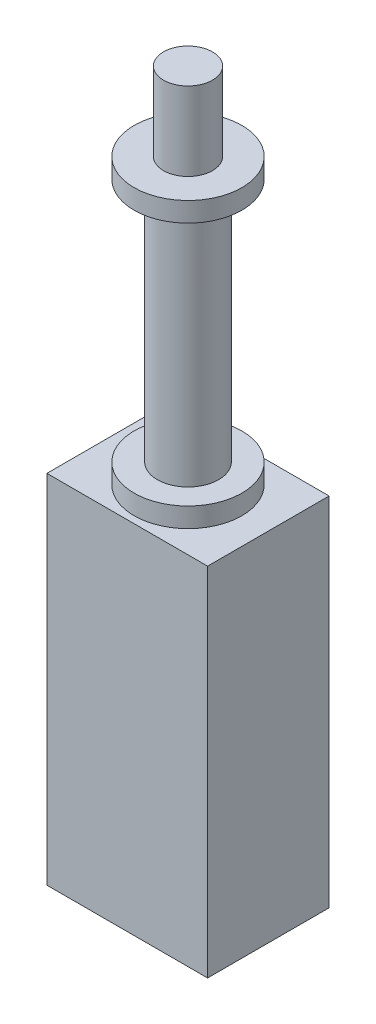
ISO-10303-21;
HEADER;
FILE_DESCRIPTION(('STEP AP214'),'2;1');
FILE_NAME('part.step','',(''),(''),'','','');
FILE_SCHEMA(('AUTOMOTIVE_DESIGN { 1 0 10303 214 1 1 1 1 }'));
ENDSEC;
DATA;
#1=APPLICATION_CONTEXT('core data for automotive mechanical design processes');
#2=APPLICATION_PROTOCOL_DEFINITION('international standard','automotive_design',2000,#1);
#3=PRODUCT_CONTEXT('',#1,'mechanical');
#4=PRODUCT('Part','Part','',(#3));
#5=PRODUCT_RELATED_PRODUCT_CATEGORY('part','',(#4));
#6=PRODUCT_DEFINITION_FORMATION('','',#4);
#7=PRODUCT_DEFINITION_CONTEXT('part definition',#1,'design');
#8=PRODUCT_DEFINITION('design','',#6,#7);
#9=PRODUCT_DEFINITION_SHAPE('','',#8);
#10=(LENGTH_UNIT() NAMED_UNIT(*) SI_UNIT(.MILLI.,.METRE.));
#11=(NAMED_UNIT(*) PLANE_ANGLE_UNIT() SI_UNIT($,.RADIAN.));
#12=(NAMED_UNIT(*) SI_UNIT($,.STERADIAN.) SOLID_ANGLE_UNIT());
#13=UNCERTAINTY_MEASURE_WITH_UNIT(LENGTH_MEASURE(1.E-05),#10,'distance_accuracy_value','');
#14=(GEOMETRIC_REPRESENTATION_CONTEXT(3) GLOBAL_UNCERTAINTY_ASSIGNED_CONTEXT((#13)) GLOBAL_UNIT_ASSIGNED_CONTEXT((#10,
#11,#12)) REPRESENTATION_CONTEXT('',''));
#15=CARTESIAN_POINT('',(0.,0.,0.));
#16=DIRECTION('',(0.,0.,1.));
#17=DIRECTION('',(1.,0.,0.));
#18=AXIS2_PLACEMENT_3D('',#15,#16,#17);
#19=CARTESIAN_POINT('',(0.,-184.15,0.));
#20=DIRECTION('',(0.,1.,0.));
#21=DIRECTION('',(0.,0.,1.));
#22=AXIS2_PLACEMENT_3D('',#19,#20,#21);
#23=CYLINDRICAL_SURFACE('',#22,19.8660039897743);
#24=CARTESIAN_POINT('',(0.,-12.7,0.));
#25=DIRECTION('',(0.,1.,0.));
#26=DIRECTION('',(0.,0.,1.));
#27=AXIS2_PLACEMENT_3D('',#24,#25,#26);
#28=CIRCLE('',#27,19.8660039897743);
#29=CARTESIAN_POINT('',(0.,-12.7,19.8660039897743));
#30=VERTEX_POINT('',#29);
#31=EDGE_CURVE('E134',#30,#30,#28,.T.);
#32=ORIENTED_EDGE('',*,*,#31,.F.);
#33=EDGE_LOOP('',(#32));
#34=FACE_BOUND('',#33,.T.);
#35=CARTESIAN_POINT('',(0.,-171.45,0.));
#36=DIRECTION('',(0.,-1.,0.));
#37=DIRECTION('',(0.,0.,-1.));
#38=AXIS2_PLACEMENT_3D('',#35,#36,#37);
#39=CIRCLE('',#38,19.8660039897743);
#40=CARTESIAN_POINT('',(0.,-171.45,-19.8660039897743));
#41=VERTEX_POINT('',#40);
#42=EDGE_CURVE('E50',#41,#41,#39,.F.);
#43=ORIENTED_EDGE('',*,*,#42,.T.);
#44=EDGE_LOOP('',(#43));
#45=FACE_BOUND('',#44,.T.);
#46=ADVANCED_FACE('F46',(#34,#45),#23,.T.);
#47=CARTESIAN_POINT('',(0.,0.,0.));
#48=DIRECTION('',(0.,1.,0.));
#49=DIRECTION('',(0.,0.,1.));
#50=AXIS2_PLACEMENT_3D('',#47,#48,#49);
#51=PLANE('',#50);
#52=CARTESIAN_POINT('',(0.,0.,0.));
#53=DIRECTION('',(0.,1.,0.));
#54=DIRECTION('',(0.,0.,1.));
#55=AXIS2_PLACEMENT_3D('',#52,#53,#54);
#56=CIRCLE('',#55,34.925);
#57=CARTESIAN_POINT('',(0.,0.,34.9250000000001));
#58=VERTEX_POINT('',#57);
#59=EDGE_CURVE('E56',#58,#58,#56,.T.);
#60=ORIENTED_EDGE('',*,*,#59,.T.);
#61=EDGE_LOOP('',(#60));
#62=FACE_BOUND('',#61,.T.);
#63=CARTESIAN_POINT('',(0.,0.,0.));
#64=DIRECTION('',(0.,1.,0.));
#65=DIRECTION('',(0.,0.,1.));
#66=AXIS2_PLACEMENT_3D('',#63,#64,#65);
#67=CIRCLE('',#66,15.875);
#68=CARTESIAN_POINT('',(0.,0.,15.8750000000001));
#69=VERTEX_POINT('',#68);
#70=EDGE_CURVE('E135',#69,#69,#67,.T.);
#71=ORIENTED_EDGE('',*,*,#70,.F.);
#72=EDGE_LOOP('',(#71));
#73=FACE_BOUND('',#72,.T.);
#74=ADVANCED_FACE('F142',(#62,#73),#51,.T.);
#75=CARTESIAN_POINT('',(0.,-12.7,0.));
#76=DIRECTION('',(0.,1.,0.));
#77=DIRECTION('',(0.,0.,1.));
#78=AXIS2_PLACEMENT_3D('',#75,#76,#77);
#79=CYLINDRICAL_SURFACE('',#78,34.925);
#80=CARTESIAN_POINT('',(0.,-12.7,0.));
#81=DIRECTION('',(0.,1.,0.));
#82=DIRECTION('',(0.,0.,1.));
#83=AXIS2_PLACEMENT_3D('',#80,#81,#82);
#84=CIRCLE('',#83,34.925);
#85=CARTESIAN_POINT('',(0.,-12.7,34.9250000000001));
#86=VERTEX_POINT('',#85);
#87=EDGE_CURVE('E13',#86,#86,#84,.T.);
#88=ORIENTED_EDGE('',*,*,#87,.T.);
#89=EDGE_LOOP('',(#88));
#90=FACE_BOUND('',#89,.T.);
#91=ORIENTED_EDGE('',*,*,#59,.F.);
#92=EDGE_LOOP('',(#91));
#93=FACE_BOUND('',#92,.T.);
#94=ADVANCED_FACE('F48',(#90,#93),#79,.T.);
#95=CARTESIAN_POINT('',(0.,-12.7,0.));
#96=DIRECTION('',(0.,1.,0.));
#97=DIRECTION('',(0.,0.,1.));
#98=AXIS2_PLACEMENT_3D('',#95,#96,#97);
#99=PLANE('',#98);
#100=ORIENTED_EDGE('',*,*,#31,.T.);
#101=EDGE_LOOP('',(#100));
#102=FACE_BOUND('',#101,.T.);
#103=ORIENTED_EDGE('',*,*,#87,.F.);
#104=EDGE_LOOP('',(#103));
#105=FACE_BOUND('',#104,.T.);
#106=ADVANCED_FACE('F146',(#102,#105),#99,.F.);
#107=CARTESIAN_POINT('',(0.,50.8,0.));
#108=DIRECTION('',(0.,-1.,0.));
#109=DIRECTION('',(0.,0.,-1.));
#110=AXIS2_PLACEMENT_3D('',#107,#108,#109);
#111=CYLINDRICAL_SURFACE('',#110,15.875);
#112=CARTESIAN_POINT('',(0.,50.8,0.));
#113=DIRECTION('',(0.,1.,0.));
#114=DIRECTION('',(0.,0.,1.));
#115=AXIS2_PLACEMENT_3D('',#112,#113,#114);
#116=CIRCLE('',#115,15.875);
#117=CARTESIAN_POINT('',(0.,50.8,15.8750000000001));
#118=VERTEX_POINT('',#117);
#119=EDGE_CURVE('E131',#118,#118,#116,.T.);
#120=ORIENTED_EDGE('',*,*,#119,.F.);
#121=EDGE_LOOP('',(#120));
#122=FACE_BOUND('',#121,.T.);
#123=ORIENTED_EDGE('',*,*,#70,.T.);
#124=EDGE_LOOP('',(#123));
#125=FACE_BOUND('',#124,.T.);
#126=ADVANCED_FACE('F152',(#122,#125),#111,.T.);
#127=CARTESIAN_POINT('',(0.,50.8,0.));
#128=DIRECTION('',(0.,1.,0.));
#129=DIRECTION('',(0.,0.,1.));
#130=AXIS2_PLACEMENT_3D('',#127,#128,#129);
#131=PLANE('',#130);
#132=ORIENTED_EDGE('',*,*,#119,.T.);
#133=EDGE_LOOP('',(#132));
#134=FACE_BOUND('',#133,.T.);
#135=ADVANCED_FACE('F165',(#134),#131,.T.);
#136=CARTESIAN_POINT('',(0.,-171.45,0.));
#137=DIRECTION('',(0.,-1.,0.));
#138=DIRECTION('',(0.,0.,-1.));
#139=AXIS2_PLACEMENT_3D('',#136,#137,#138);
#140=CYLINDRICAL_SURFACE('',#139,34.925);
#141=CARTESIAN_POINT('',(0.,-171.45,0.));
#142=DIRECTION('',(0.,-1.,0.));
#143=DIRECTION('',(0.,0.,-1.));
#144=AXIS2_PLACEMENT_3D('',#141,#142,#143);
#145=CIRCLE('',#144,34.925);
#146=CARTESIAN_POINT('',(0.,-171.45,-34.9250000000001));
#147=VERTEX_POINT('',#146);
#148=EDGE_CURVE('E126',#147,#147,#145,.T.);
#149=ORIENTED_EDGE('',*,*,#148,.T.);
#150=EDGE_LOOP('',(#149));
#151=FACE_BOUND('',#150,.T.);
#152=CARTESIAN_POINT('',(0.,-184.15,0.));
#153=DIRECTION('',(0.,-1.,0.));
#154=DIRECTION('',(0.,0.,-1.));
#155=AXIS2_PLACEMENT_3D('',#152,#153,#154);
#156=CIRCLE('',#155,34.925);
#157=CARTESIAN_POINT('',(0.,-184.15,-34.9250000000001));
#158=VERTEX_POINT('',#157);
#159=EDGE_CURVE('E125',#158,#158,#156,.T.);
#160=ORIENTED_EDGE('',*,*,#159,.F.);
#161=EDGE_LOOP('',(#160));
#162=FACE_BOUND('',#161,.T.);
#163=ADVANCED_FACE('F169',(#151,#162),#140,.T.);
#164=CARTESIAN_POINT('',(0.,-171.45,0.));
#165=DIRECTION('',(0.,-1.,0.));
#166=DIRECTION('',(0.,0.,-1.));
#167=AXIS2_PLACEMENT_3D('',#164,#165,#166);
#168=PLANE('',#167);
#169=ORIENTED_EDGE('',*,*,#42,.F.);
#170=EDGE_LOOP('',(#169));
#171=FACE_BOUND('',#170,.T.);
#172=ORIENTED_EDGE('',*,*,#148,.F.);
#173=EDGE_LOOP('',(#172));
#174=FACE_BOUND('',#173,.T.);
#175=ADVANCED_FACE('F173',(#171,#174),#168,.F.);
#176=CARTESIAN_POINT('',(-52.0700000000001,-415.29,-39.3700000000009));
#177=DIRECTION('',(0.,0.,1.));
#178=DIRECTION('',(1.,0.,0.));
#179=AXIS2_PLACEMENT_3D('',#176,#177,#178);
#180=PLANE('',#179);
#181=DIRECTION('',(1.,0.,0.));
#182=VECTOR('',#181,1.);
#183=CARTESIAN_POINT('',(-52.0700000000001,-184.15,-39.37));
#184=LINE('',#183,#182);
#185=CARTESIAN_POINT('',(-52.0700000000001,-184.15,-39.37));
#186=VERTEX_POINT('',#185);
#187=CARTESIAN_POINT('',(52.0700000000001,-184.15,-39.37));
#188=VERTEX_POINT('',#187);
#189=EDGE_CURVE('E116',#186,#188,#184,.T.);
#190=ORIENTED_EDGE('',*,*,#189,.T.);
#191=DIRECTION('',(0.,1.,0.));
#192=VECTOR('',#191,1.);
#193=CARTESIAN_POINT('',(52.0700000000001,-415.29,-39.370000000001));
#194=LINE('',#193,#192);
#195=CARTESIAN_POINT('',(52.0700000000001,-415.29,-39.370000000001));
#196=VERTEX_POINT('',#195);
#197=EDGE_CURVE('E107',#196,#188,#194,.T.);
#198=ORIENTED_EDGE('',*,*,#197,.F.);
#199=DIRECTION('',(1.,0.,0.));
#200=VECTOR('',#199,1.);
#201=CARTESIAN_POINT('',(-52.0700000000001,-415.29,-39.3700000000009));
#202=LINE('',#201,#200);
#203=CARTESIAN_POINT('',(-52.0700000000001,-415.29,-39.3700000000009));
#204=VERTEX_POINT('',#203);
#205=EDGE_CURVE('E101',#204,#196,#202,.T.);
#206=ORIENTED_EDGE('',*,*,#205,.F.);
#207=DIRECTION('',(0.,1.,0.));
#208=VECTOR('',#207,1.);
#209=CARTESIAN_POINT('',(-52.0700000000001,-415.29,-39.3700000000009));
#210=LINE('',#209,#208);
#211=EDGE_CURVE('E112',#204,#186,#210,.T.);
#212=ORIENTED_EDGE('',*,*,#211,.T.);
#213=EDGE_LOOP('',(#190,#198,#206,#212));
#214=FACE_BOUND('',#213,.T.);
#215=ADVANCED_FACE('F177',(#214),#180,.F.);
#216=CARTESIAN_POINT('',(52.0700000000001,-415.29,39.37));
#217=DIRECTION('',(-1.,0.,0.));
#218=DIRECTION('',(0.,0.,1.));
#219=AXIS2_PLACEMENT_3D('',#216,#217,#218);
#220=PLANE('',#219);
#221=DIRECTION('',(0.,0.,1.));
#222=VECTOR('',#221,1.);
#223=CARTESIAN_POINT('',(52.0700000000001,-184.15,39.370000000001));
#224=LINE('',#223,#222);
#225=CARTESIAN_POINT('',(52.0700000000001,-184.15,39.370000000001));
#226=VERTEX_POINT('',#225);
#227=EDGE_CURVE('E106',#188,#226,#224,.T.);
#228=ORIENTED_EDGE('',*,*,#227,.T.);
#229=DIRECTION('',(0.,1.,0.));
#230=VECTOR('',#229,1.);
#231=CARTESIAN_POINT('',(52.0700000000001,-415.29,39.37));
#232=LINE('',#231,#230);
#233=CARTESIAN_POINT('',(52.0700000000001,-415.29,39.37));
#234=VERTEX_POINT('',#233);
#235=EDGE_CURVE('E104',#234,#226,#232,.T.);
#236=ORIENTED_EDGE('',*,*,#235,.F.);
#237=DIRECTION('',(0.,0.,1.));
#238=VECTOR('',#237,1.);
#239=CARTESIAN_POINT('',(52.0700000000001,-415.29,39.37));
#240=LINE('',#239,#238);
#241=EDGE_CURVE('E96',#196,#234,#240,.T.);
#242=ORIENTED_EDGE('',*,*,#241,.F.);
#243=ORIENTED_EDGE('',*,*,#197,.T.);
#244=EDGE_LOOP('',(#228,#236,#242,#243));
#245=FACE_BOUND('',#244,.T.);
#246=ADVANCED_FACE('F105',(#245),#220,.F.);
#247=CARTESIAN_POINT('',(-52.0700000000001,-415.29,39.3700000000009));
#248=DIRECTION('',(0.,0.,-1.));
#249=DIRECTION('',(-1.,0.,0.));
#250=AXIS2_PLACEMENT_3D('',#247,#248,#249);
#251=PLANE('',#250);
#252=DIRECTION('',(-1.,0.,0.));
#253=VECTOR('',#252,1.);
#254=CARTESIAN_POINT('',(-52.0700000000001,-184.15,39.370000000001));
#255=LINE('',#254,#253);
#256=CARTESIAN_POINT('',(-52.0700000000001,-184.15,39.370000000001));
#257=VERTEX_POINT('',#256);
#258=EDGE_CURVE('E82',#226,#257,#255,.T.);
#259=ORIENTED_EDGE('',*,*,#258,.T.);
#260=DIRECTION('',(0.,1.,0.));
#261=VECTOR('',#260,1.);
#262=CARTESIAN_POINT('',(-52.0700000000001,-415.29,39.3700000000009));
#263=LINE('',#262,#261);
#264=CARTESIAN_POINT('',(-52.0700000000001,-415.29,39.3700000000009));
#265=VERTEX_POINT('',#264);
#266=EDGE_CURVE('E108',#265,#257,#263,.T.);
#267=ORIENTED_EDGE('',*,*,#266,.F.);
#268=DIRECTION('',(-1.,0.,0.));
#269=VECTOR('',#268,1.);
#270=CARTESIAN_POINT('',(-52.0700000000001,-415.29,39.3700000000009));
#271=LINE('',#270,#269);
#272=EDGE_CURVE('E99',#234,#265,#271,.T.);
#273=ORIENTED_EDGE('',*,*,#272,.F.);
#274=ORIENTED_EDGE('',*,*,#235,.T.);
#275=EDGE_LOOP('',(#259,#267,#273,#274));
#276=FACE_BOUND('',#275,.T.);
#277=ADVANCED_FACE('F110',(#276),#251,.F.);
#278=CARTESIAN_POINT('',(-52.0700000000001,-415.29,39.3700000000009));
#279=DIRECTION('',(1.,0.,0.));
#280=DIRECTION('',(0.,0.,-1.));
#281=AXIS2_PLACEMENT_3D('',#278,#279,#280);
#282=PLANE('',#281);
#283=DIRECTION('',(0.,0.,-1.));
#284=VECTOR('',#283,1.);
#285=CARTESIAN_POINT('',(-52.0700000000001,-184.15,39.370000000001));
#286=LINE('',#285,#284);
#287=EDGE_CURVE('E88',#257,#186,#286,.T.);
#288=ORIENTED_EDGE('',*,*,#287,.T.);
#289=ORIENTED_EDGE('',*,*,#211,.F.);
#290=DIRECTION('',(0.,0.,-1.));
#291=VECTOR('',#290,1.);
#292=CARTESIAN_POINT('',(-52.0700000000001,-415.29,39.3700000000009));
#293=LINE('',#292,#291);
#294=EDGE_CURVE('E65',#265,#204,#293,.T.);
#295=ORIENTED_EDGE('',*,*,#294,.F.);
#296=ORIENTED_EDGE('',*,*,#266,.T.);
#297=EDGE_LOOP('',(#288,#289,#295,#296));
#298=FACE_BOUND('',#297,.T.);
#299=ADVANCED_FACE('F186',(#298),#282,.F.);
#300=CARTESIAN_POINT('',(52.0700000000001,-415.29,-39.370000000001));
#301=DIRECTION('',(0.,1.,0.));
#302=DIRECTION('',(0.,0.,1.));
#303=AXIS2_PLACEMENT_3D('',#300,#301,#302);
#304=PLANE('',#303);
#305=ORIENTED_EDGE('',*,*,#205,.T.);
#306=ORIENTED_EDGE('',*,*,#241,.T.);
#307=ORIENTED_EDGE('',*,*,#272,.T.);
#308=ORIENTED_EDGE('',*,*,#294,.T.);
#309=EDGE_LOOP('',(#305,#306,#307,#308));
#310=FACE_BOUND('',#309,.T.);
#311=ADVANCED_FACE('F97',(#310),#304,.F.);
#312=CARTESIAN_POINT('',(52.0700000000001,-184.15,-39.37));
#313=DIRECTION('',(0.,1.,0.));
#314=DIRECTION('',(0.,0.,1.));
#315=AXIS2_PLACEMENT_3D('',#312,#313,#314);
#316=PLANE('',#315);
#317=ORIENTED_EDGE('',*,*,#159,.T.);
#318=EDGE_LOOP('',(#317));
#319=FACE_BOUND('',#318,.T.);
#320=ORIENTED_EDGE('',*,*,#189,.F.);
#321=ORIENTED_EDGE('',*,*,#287,.F.);
#322=ORIENTED_EDGE('',*,*,#258,.F.);
#323=ORIENTED_EDGE('',*,*,#227,.F.);
#324=EDGE_LOOP('',(#320,#321,#322,#323));
#325=FACE_BOUND('',#324,.T.);
#326=ADVANCED_FACE('F189',(#319,#325),#316,.T.);
#327=CLOSED_SHELL('',(#46,#74,#94,#106,#126,#135,#163,#175,#215,#246,#277,#299,#311,#326));
#328=MANIFOLD_SOLID_BREP('B2',#327);
#329=ADVANCED_BREP_SHAPE_REPRESENTATION('',(#18,#328),#14);
#330=SHAPE_DEFINITION_REPRESENTATION(#9,#329);
ENDSEC;
END-ISO-10303-21;
